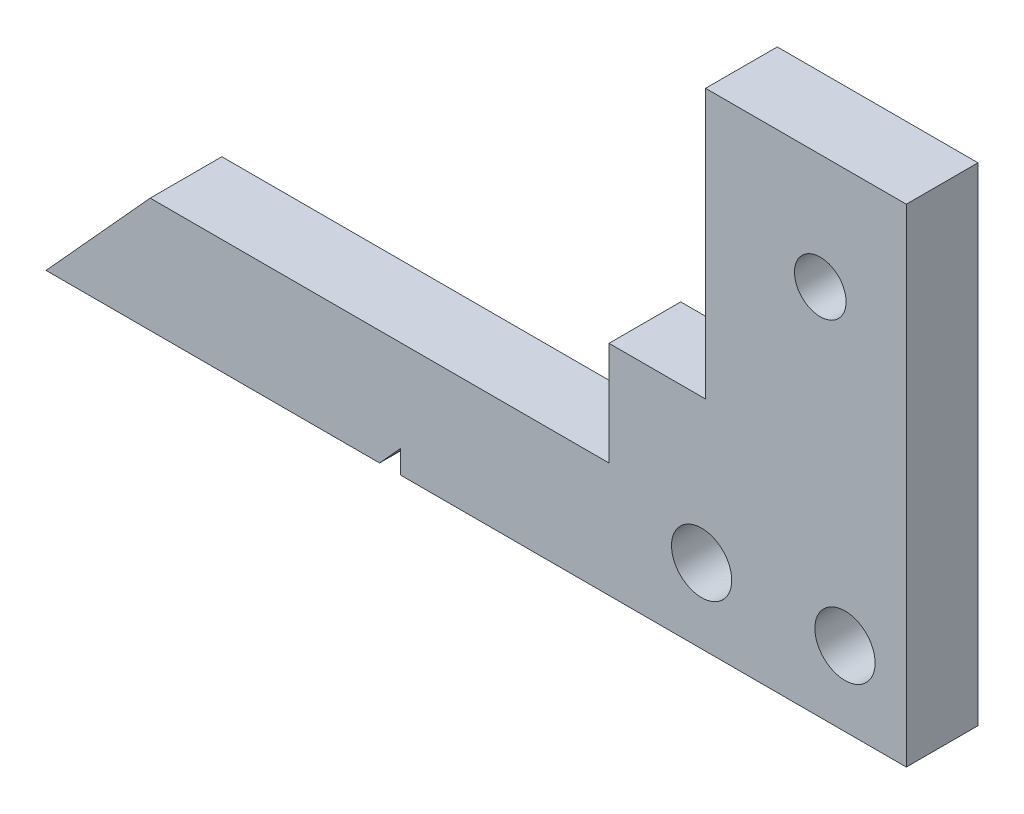
ISO-10303-21;
HEADER;
FILE_DESCRIPTION(('STEP AP214'),'2;1');
FILE_NAME('part.step','',(''),(''),'','','');
FILE_SCHEMA(('AUTOMOTIVE_DESIGN { 1 0 10303 214 1 1 1 1 }'));
ENDSEC;
DATA;
#1=APPLICATION_CONTEXT('core data for automotive mechanical design processes');
#2=APPLICATION_PROTOCOL_DEFINITION('international standard','automotive_design',2000,#1);
#3=PRODUCT_CONTEXT('',#1,'mechanical');
#4=PRODUCT('Part','Part','',(#3));
#5=PRODUCT_RELATED_PRODUCT_CATEGORY('part','',(#4));
#6=PRODUCT_DEFINITION_FORMATION('','',#4);
#7=PRODUCT_DEFINITION_CONTEXT('part definition',#1,'design');
#8=PRODUCT_DEFINITION('design','',#6,#7);
#9=PRODUCT_DEFINITION_SHAPE('','',#8);
#10=(LENGTH_UNIT() NAMED_UNIT(*) SI_UNIT(.MILLI.,.METRE.));
#11=(NAMED_UNIT(*) PLANE_ANGLE_UNIT() SI_UNIT($,.RADIAN.));
#12=(NAMED_UNIT(*) SI_UNIT($,.STERADIAN.) SOLID_ANGLE_UNIT());
#13=UNCERTAINTY_MEASURE_WITH_UNIT(LENGTH_MEASURE(1.E-05),#10,'distance_accuracy_value','');
#14=(GEOMETRIC_REPRESENTATION_CONTEXT(3) GLOBAL_UNCERTAINTY_ASSIGNED_CONTEXT((#13)) GLOBAL_UNIT_ASSIGNED_CONTEXT((#10,
#11,#12)) REPRESENTATION_CONTEXT('',''));
#15=CARTESIAN_POINT('',(0.,0.,0.));
#16=DIRECTION('',(0.,0.,1.));
#17=DIRECTION('',(1.,0.,0.));
#18=AXIS2_PLACEMENT_3D('',#15,#16,#17);
#19=CARTESIAN_POINT('',(0.,0.,3.175));
#20=DIRECTION('',(0.,0.,-1.));
#21=DIRECTION('',(-1.,0.,0.));
#22=AXIS2_PLACEMENT_3D('',#19,#20,#21);
#23=PLANE('',#22);
#24=DIRECTION('',(1.,0.,0.));
#25=VECTOR('',#24,1.);
#26=CARTESIAN_POINT('',(0.,0.,3.175));
#27=LINE('',#26,#25);
#28=CARTESIAN_POINT('',(0.,0.,3.175));
#29=VERTEX_POINT('',#28);
#30=CARTESIAN_POINT('',(14.773655525725,0.,3.175));
#31=VERTEX_POINT('',#30);
#32=EDGE_CURVE('E175',#29,#31,#27,.T.);
#33=ORIENTED_EDGE('',*,*,#32,.T.);
#34=DIRECTION('',(0.672311585903437,0.740268283435138,0.));
#35=VECTOR('',#34,1.);
#36=CARTESIAN_POINT('',(14.773655525725,0.,3.175));
#37=LINE('',#36,#35);
#38=CARTESIAN_POINT('',(15.7005576806385,1.02059265601992,3.175));
#39=VERTEX_POINT('',#38);
#40=EDGE_CURVE('E108',#31,#39,#37,.T.);
#41=ORIENTED_EDGE('',*,*,#40,.T.);
#42=DIRECTION('',(0.,-1.,0.));
#43=VECTOR('',#42,1.);
#44=CARTESIAN_POINT('',(15.7005576806385,1.02059265601992,3.175));
#45=LINE('',#44,#43);
#46=CARTESIAN_POINT('',(15.7005576806385,0.,3.175));
#47=VERTEX_POINT('',#46);
#48=EDGE_CURVE('E199',#39,#47,#45,.T.);
#49=ORIENTED_EDGE('',*,*,#48,.T.);
#50=DIRECTION('',(1.,0.,0.));
#51=VECTOR('',#50,1.);
#52=CARTESIAN_POINT('',(15.7005576806385,0.,3.175));
#53=LINE('',#52,#51);
#54=CARTESIAN_POINT('',(38.1,0.,3.175));
#55=VERTEX_POINT('',#54);
#56=EDGE_CURVE('E218',#47,#55,#53,.T.);
#57=ORIENTED_EDGE('',*,*,#56,.T.);
#58=DIRECTION('',(0.,1.,0.));
#59=VECTOR('',#58,1.);
#60=CARTESIAN_POINT('',(38.1,21.59,3.175));
#61=LINE('',#60,#59);
#62=CARTESIAN_POINT('',(38.1,21.59,3.175));
#63=VERTEX_POINT('',#62);
#64=EDGE_CURVE('E215',#55,#63,#61,.T.);
#65=ORIENTED_EDGE('',*,*,#64,.T.);
#66=DIRECTION('',(-1.,0.,0.));
#67=VECTOR('',#66,1.);
#68=CARTESIAN_POINT('',(29.21,21.59,3.175));
#69=LINE('',#68,#67);
#70=CARTESIAN_POINT('',(29.21,21.59,3.175));
#71=VERTEX_POINT('',#70);
#72=EDGE_CURVE('E217',#63,#71,#69,.T.);
#73=ORIENTED_EDGE('',*,*,#72,.T.);
#74=DIRECTION('',(0.,-1.,0.));
#75=VECTOR('',#74,1.);
#76=CARTESIAN_POINT('',(29.21,9.67178294887858,3.175));
#77=LINE('',#76,#75);
#78=CARTESIAN_POINT('',(29.21,9.67178294887858,3.175));
#79=VERTEX_POINT('',#78);
#80=EDGE_CURVE('E220',#71,#79,#77,.T.);
#81=ORIENTED_EDGE('',*,*,#80,.T.);
#82=DIRECTION('',(-1.,0.,0.));
#83=VECTOR('',#82,1.);
#84=CARTESIAN_POINT('',(24.933655525725,9.67178294887858,3.175));
#85=LINE('',#84,#83);
#86=CARTESIAN_POINT('',(24.933655525725,9.67178294887858,3.175));
#87=VERTEX_POINT('',#86);
#88=EDGE_CURVE('E136',#79,#87,#85,.T.);
#89=ORIENTED_EDGE('',*,*,#88,.T.);
#90=DIRECTION('',(0.,-1.,0.));
#91=VECTOR('',#90,1.);
#92=CARTESIAN_POINT('',(24.933655525725,5.08,3.175));
#93=LINE('',#92,#91);
#94=CARTESIAN_POINT('',(24.933655525725,5.08,3.175));
#95=VERTEX_POINT('',#94);
#96=EDGE_CURVE('E130',#87,#95,#93,.T.);
#97=ORIENTED_EDGE('',*,*,#96,.T.);
#98=DIRECTION('',(-1.,0.,0.));
#99=VECTOR('',#98,1.);
#100=CARTESIAN_POINT('',(4.61365552572496,5.08,3.175));
#101=LINE('',#100,#99);
#102=CARTESIAN_POINT('',(4.61365552572496,5.08,3.175));
#103=VERTEX_POINT('',#102);
#104=EDGE_CURVE('E134',#95,#103,#101,.T.);
#105=ORIENTED_EDGE('',*,*,#104,.T.);
#106=DIRECTION('',(-0.672311585903436,-0.740268283435139,0.));
#107=VECTOR('',#106,1.);
#108=CARTESIAN_POINT('',(0.,0.,3.175));
#109=LINE('',#108,#107);
#110=EDGE_CURVE('E56',#103,#29,#109,.T.);
#111=ORIENTED_EDGE('',*,*,#110,.T.);
#112=EDGE_LOOP('',(#33,#41,#49,#57,#65,#73,#81,#89,#97,#105,#111));
#113=FACE_BOUND('',#112,.T.);
#114=CARTESIAN_POINT('',(29.0339931584545,3.29950985593106,3.175));
#115=DIRECTION('',(0.,0.,1.));
#116=DIRECTION('',(1.,0.,0.));
#117=AXIS2_PLACEMENT_3D('',#114,#115,#116);
#118=CIRCLE('',#117,1.3335);
#119=CARTESIAN_POINT('',(30.3674931584545,3.29950985593106,3.175));
#120=VERTEX_POINT('',#119);
#121=EDGE_CURVE('E158',#120,#120,#118,.T.);
#122=ORIENTED_EDGE('',*,*,#121,.F.);
#123=EDGE_LOOP('',(#122));
#124=FACE_BOUND('',#123,.T.);
#125=CARTESIAN_POINT('',(35.3839931584545,3.29950985593106,3.175));
#126=DIRECTION('',(0.,0.,1.));
#127=DIRECTION('',(1.,0.,0.));
#128=AXIS2_PLACEMENT_3D('',#125,#126,#127);
#129=CIRCLE('',#128,1.3335);
#130=CARTESIAN_POINT('',(36.7174931584545,3.29950985593106,3.175));
#131=VERTEX_POINT('',#130);
#132=EDGE_CURVE('E277',#131,#131,#129,.T.);
#133=ORIENTED_EDGE('',*,*,#132,.F.);
#134=EDGE_LOOP('',(#133));
#135=FACE_BOUND('',#134,.T.);
#136=CARTESIAN_POINT('',(34.29,16.51,3.175));
#137=DIRECTION('',(0.,0.,1.));
#138=DIRECTION('',(1.,0.,0.));
#139=AXIS2_PLACEMENT_3D('',#136,#137,#138);
#140=CIRCLE('',#139,1.143);
#141=CARTESIAN_POINT('',(35.433,16.51,3.175));
#142=VERTEX_POINT('',#141);
#143=EDGE_CURVE('E268',#142,#142,#140,.T.);
#144=ORIENTED_EDGE('',*,*,#143,.F.);
#145=EDGE_LOOP('',(#144));
#146=FACE_BOUND('',#145,.T.);
#147=ADVANCED_FACE('F39',(#113,#124,#135,#146),#23,.F.);
#148=CARTESIAN_POINT('',(0.,0.,0.));
#149=DIRECTION('',(0.,0.,-1.));
#150=DIRECTION('',(-1.,0.,0.));
#151=AXIS2_PLACEMENT_3D('',#148,#149,#150);
#152=PLANE('',#151);
#153=CARTESIAN_POINT('',(35.3839931584545,3.29950985593106,0.));
#154=DIRECTION('',(0.,0.,1.));
#155=DIRECTION('',(1.,0.,0.));
#156=AXIS2_PLACEMENT_3D('',#153,#154,#155);
#157=CIRCLE('',#156,1.3335);
#158=CARTESIAN_POINT('',(36.7174931584545,3.29950985593106,0.));
#159=VERTEX_POINT('',#158);
#160=EDGE_CURVE('E274',#159,#159,#157,.T.);
#161=ORIENTED_EDGE('',*,*,#160,.T.);
#162=EDGE_LOOP('',(#161));
#163=FACE_BOUND('',#162,.T.);
#164=DIRECTION('',(1.,0.,0.));
#165=VECTOR('',#164,1.);
#166=CARTESIAN_POINT('',(0.,0.,0.));
#167=LINE('',#166,#165);
#168=CARTESIAN_POINT('',(0.,0.,0.));
#169=VERTEX_POINT('',#168);
#170=CARTESIAN_POINT('',(14.773655525725,0.,0.));
#171=VERTEX_POINT('',#170);
#172=EDGE_CURVE('E154',#169,#171,#167,.T.);
#173=ORIENTED_EDGE('',*,*,#172,.F.);
#174=DIRECTION('',(-0.672311585903436,-0.740268283435139,0.));
#175=VECTOR('',#174,1.);
#176=CARTESIAN_POINT('',(0.,0.,0.));
#177=LINE('',#176,#175);
#178=CARTESIAN_POINT('',(4.61365552572496,5.08,0.));
#179=VERTEX_POINT('',#178);
#180=EDGE_CURVE('E100',#179,#169,#177,.T.);
#181=ORIENTED_EDGE('',*,*,#180,.F.);
#182=DIRECTION('',(-1.,0.,0.));
#183=VECTOR('',#182,1.);
#184=CARTESIAN_POINT('',(4.61365552572496,5.08,0.));
#185=LINE('',#184,#183);
#186=CARTESIAN_POINT('',(24.933655525725,5.08,0.));
#187=VERTEX_POINT('',#186);
#188=EDGE_CURVE('E94',#187,#179,#185,.T.);
#189=ORIENTED_EDGE('',*,*,#188,.F.);
#190=DIRECTION('',(0.,-1.,0.));
#191=VECTOR('',#190,1.);
#192=CARTESIAN_POINT('',(24.933655525725,5.08,0.));
#193=LINE('',#192,#191);
#194=CARTESIAN_POINT('',(24.933655525725,9.67178294887858,0.));
#195=VERTEX_POINT('',#194);
#196=EDGE_CURVE('E144',#195,#187,#193,.T.);
#197=ORIENTED_EDGE('',*,*,#196,.F.);
#198=DIRECTION('',(-1.,0.,0.));
#199=VECTOR('',#198,1.);
#200=CARTESIAN_POINT('',(24.933655525725,9.67178294887858,0.));
#201=LINE('',#200,#199);
#202=CARTESIAN_POINT('',(29.21,9.67178294887858,0.));
#203=VERTEX_POINT('',#202);
#204=EDGE_CURVE('E170',#203,#195,#201,.T.);
#205=ORIENTED_EDGE('',*,*,#204,.F.);
#206=DIRECTION('',(0.,-1.,0.));
#207=VECTOR('',#206,1.);
#208=CARTESIAN_POINT('',(29.21,9.67178294887858,0.));
#209=LINE('',#208,#207);
#210=CARTESIAN_POINT('',(29.21,21.59,0.));
#211=VERTEX_POINT('',#210);
#212=EDGE_CURVE('E168',#211,#203,#209,.T.);
#213=ORIENTED_EDGE('',*,*,#212,.F.);
#214=DIRECTION('',(-1.,0.,0.));
#215=VECTOR('',#214,1.);
#216=CARTESIAN_POINT('',(29.21,21.59,0.));
#217=LINE('',#216,#215);
#218=CARTESIAN_POINT('',(38.1,21.59,0.));
#219=VERTEX_POINT('',#218);
#220=EDGE_CURVE('E166',#219,#211,#217,.T.);
#221=ORIENTED_EDGE('',*,*,#220,.F.);
#222=DIRECTION('',(0.,1.,0.));
#223=VECTOR('',#222,1.);
#224=CARTESIAN_POINT('',(38.1,21.59,0.));
#225=LINE('',#224,#223);
#226=CARTESIAN_POINT('',(38.1,0.,0.));
#227=VERTEX_POINT('',#226);
#228=EDGE_CURVE('E164',#227,#219,#225,.T.);
#229=ORIENTED_EDGE('',*,*,#228,.F.);
#230=DIRECTION('',(1.,0.,0.));
#231=VECTOR('',#230,1.);
#232=CARTESIAN_POINT('',(15.7005576806385,0.,0.));
#233=LINE('',#232,#231);
#234=CARTESIAN_POINT('',(15.7005576806385,0.,0.));
#235=VERTEX_POINT('',#234);
#236=EDGE_CURVE('E162',#235,#227,#233,.T.);
#237=ORIENTED_EDGE('',*,*,#236,.F.);
#238=DIRECTION('',(0.,-1.,0.));
#239=VECTOR('',#238,1.);
#240=CARTESIAN_POINT('',(15.7005576806385,1.02059265601992,0.));
#241=LINE('',#240,#239);
#242=CARTESIAN_POINT('',(15.7005576806385,1.02059265601992,0.));
#243=VERTEX_POINT('',#242);
#244=EDGE_CURVE('E160',#243,#235,#241,.T.);
#245=ORIENTED_EDGE('',*,*,#244,.F.);
#246=DIRECTION('',(0.672311585903437,0.740268283435138,0.));
#247=VECTOR('',#246,1.);
#248=CARTESIAN_POINT('',(14.773655525725,0.,0.));
#249=LINE('',#248,#247);
#250=EDGE_CURVE('E157',#171,#243,#249,.T.);
#251=ORIENTED_EDGE('',*,*,#250,.F.);
#252=EDGE_LOOP('',(#173,#181,#189,#197,#205,#213,#221,#229,#237,#245,#251));
#253=FACE_BOUND('',#252,.T.);
#254=CARTESIAN_POINT('',(29.0339931584545,3.29950985593106,0.));
#255=DIRECTION('',(0.,0.,1.));
#256=DIRECTION('',(1.,0.,0.));
#257=AXIS2_PLACEMENT_3D('',#254,#255,#256);
#258=CIRCLE('',#257,1.3335);
#259=CARTESIAN_POINT('',(30.3674931584545,3.29950985593106,0.));
#260=VERTEX_POINT('',#259);
#261=EDGE_CURVE('E280',#260,#260,#258,.T.);
#262=ORIENTED_EDGE('',*,*,#261,.T.);
#263=EDGE_LOOP('',(#262));
#264=FACE_BOUND('',#263,.T.);
#265=CARTESIAN_POINT('',(34.29,16.51,0.));
#266=DIRECTION('',(0.,0.,1.));
#267=DIRECTION('',(1.,0.,0.));
#268=AXIS2_PLACEMENT_3D('',#265,#266,#267);
#269=CIRCLE('',#268,1.143);
#270=CARTESIAN_POINT('',(35.433,16.51,0.));
#271=VERTEX_POINT('',#270);
#272=EDGE_CURVE('E271',#271,#271,#269,.T.);
#273=ORIENTED_EDGE('',*,*,#272,.T.);
#274=EDGE_LOOP('',(#273));
#275=FACE_BOUND('',#274,.T.);
#276=ADVANCED_FACE('F203',(#163,#253,#264,#275),#152,.T.);
#277=CARTESIAN_POINT('',(0.,0.,3.175));
#278=DIRECTION('',(0.,1.,0.));
#279=DIRECTION('',(0.,0.,1.));
#280=AXIS2_PLACEMENT_3D('',#277,#278,#279);
#281=PLANE('',#280);
#282=ORIENTED_EDGE('',*,*,#172,.T.);
#283=DIRECTION('',(0.,0.,-1.));
#284=VECTOR('',#283,1.);
#285=CARTESIAN_POINT('',(14.773655525725,0.,3.175));
#286=LINE('',#285,#284);
#287=EDGE_CURVE('E11',#31,#171,#286,.T.);
#288=ORIENTED_EDGE('',*,*,#287,.F.);
#289=ORIENTED_EDGE('',*,*,#32,.F.);
#290=DIRECTION('',(0.,0.,-1.));
#291=VECTOR('',#290,1.);
#292=CARTESIAN_POINT('',(0.,0.,3.175));
#293=LINE('',#292,#291);
#294=EDGE_CURVE('E150',#29,#169,#293,.T.);
#295=ORIENTED_EDGE('',*,*,#294,.T.);
#296=EDGE_LOOP('',(#282,#288,#289,#295));
#297=FACE_BOUND('',#296,.T.);
#298=ADVANCED_FACE('F41',(#297),#281,.F.);
#299=CARTESIAN_POINT('',(14.773655525725,0.,3.175));
#300=DIRECTION('',(-0.740268283435138,0.672311585903437,0.));
#301=DIRECTION('',(-0.672311585903437,-0.740268283435138,0.));
#302=AXIS2_PLACEMENT_3D('',#299,#300,#301);
#303=PLANE('',#302);
#304=ORIENTED_EDGE('',*,*,#250,.T.);
#305=DIRECTION('',(0.,0.,-1.));
#306=VECTOR('',#305,1.);
#307=CARTESIAN_POINT('',(15.7005576806385,1.02059265601992,3.175));
#308=LINE('',#307,#306);
#309=EDGE_CURVE('E48',#39,#243,#308,.T.);
#310=ORIENTED_EDGE('',*,*,#309,.F.);
#311=ORIENTED_EDGE('',*,*,#40,.F.);
#312=ORIENTED_EDGE('',*,*,#287,.T.);
#313=EDGE_LOOP('',(#304,#310,#311,#312));
#314=FACE_BOUND('',#313,.T.);
#315=ADVANCED_FACE('F376',(#314),#303,.F.);
#316=CARTESIAN_POINT('',(15.7005576806385,1.02059265601992,3.175));
#317=DIRECTION('',(1.,0.,0.));
#318=DIRECTION('',(0.,0.,-1.));
#319=AXIS2_PLACEMENT_3D('',#316,#317,#318);
#320=PLANE('',#319);
#321=ORIENTED_EDGE('',*,*,#244,.T.);
#322=DIRECTION('',(0.,0.,-1.));
#323=VECTOR('',#322,1.);
#324=CARTESIAN_POINT('',(15.7005576806385,0.,3.175));
#325=LINE('',#324,#323);
#326=EDGE_CURVE('E191',#47,#235,#325,.T.);
#327=ORIENTED_EDGE('',*,*,#326,.F.);
#328=ORIENTED_EDGE('',*,*,#48,.F.);
#329=ORIENTED_EDGE('',*,*,#309,.T.);
#330=EDGE_LOOP('',(#321,#327,#328,#329));
#331=FACE_BOUND('',#330,.T.);
#332=ADVANCED_FACE('F197',(#331),#320,.F.);
#333=CARTESIAN_POINT('',(15.7005576806385,0.,3.175));
#334=DIRECTION('',(0.,1.,0.));
#335=DIRECTION('',(0.,0.,1.));
#336=AXIS2_PLACEMENT_3D('',#333,#334,#335);
#337=PLANE('',#336);
#338=ORIENTED_EDGE('',*,*,#236,.T.);
#339=DIRECTION('',(0.,0.,-1.));
#340=VECTOR('',#339,1.);
#341=CARTESIAN_POINT('',(38.1,0.,3.175));
#342=LINE('',#341,#340);
#343=EDGE_CURVE('E188',#55,#227,#342,.T.);
#344=ORIENTED_EDGE('',*,*,#343,.F.);
#345=ORIENTED_EDGE('',*,*,#56,.F.);
#346=ORIENTED_EDGE('',*,*,#326,.T.);
#347=EDGE_LOOP('',(#338,#344,#345,#346));
#348=FACE_BOUND('',#347,.T.);
#349=ADVANCED_FACE('F209',(#348),#337,.F.);
#350=CARTESIAN_POINT('',(38.1,21.59,3.175));
#351=DIRECTION('',(-1.,0.,0.));
#352=DIRECTION('',(0.,-1.,0.));
#353=AXIS2_PLACEMENT_3D('',#350,#351,#352);
#354=PLANE('',#353);
#355=ORIENTED_EDGE('',*,*,#228,.T.);
#356=DIRECTION('',(0.,0.,-1.));
#357=VECTOR('',#356,1.);
#358=CARTESIAN_POINT('',(38.1,21.59,3.175));
#359=LINE('',#358,#357);
#360=EDGE_CURVE('E185',#63,#219,#359,.T.);
#361=ORIENTED_EDGE('',*,*,#360,.F.);
#362=ORIENTED_EDGE('',*,*,#64,.F.);
#363=ORIENTED_EDGE('',*,*,#343,.T.);
#364=EDGE_LOOP('',(#355,#361,#362,#363));
#365=FACE_BOUND('',#364,.T.);
#366=ADVANCED_FACE('F213',(#365),#354,.F.);
#367=CARTESIAN_POINT('',(29.21,21.59,3.175));
#368=DIRECTION('',(0.,-1.,0.));
#369=DIRECTION('',(0.,0.,-1.));
#370=AXIS2_PLACEMENT_3D('',#367,#368,#369);
#371=PLANE('',#370);
#372=ORIENTED_EDGE('',*,*,#220,.T.);
#373=DIRECTION('',(0.,0.,-1.));
#374=VECTOR('',#373,1.);
#375=CARTESIAN_POINT('',(29.21,21.59,3.175));
#376=LINE('',#375,#374);
#377=EDGE_CURVE('E182',#71,#211,#376,.T.);
#378=ORIENTED_EDGE('',*,*,#377,.F.);
#379=ORIENTED_EDGE('',*,*,#72,.F.);
#380=ORIENTED_EDGE('',*,*,#360,.T.);
#381=EDGE_LOOP('',(#372,#378,#379,#380));
#382=FACE_BOUND('',#381,.T.);
#383=ADVANCED_FACE('F342',(#382),#371,.F.);
#384=CARTESIAN_POINT('',(29.21,9.67178294887858,3.175));
#385=DIRECTION('',(1.,0.,0.));
#386=DIRECTION('',(0.,0.,-1.));
#387=AXIS2_PLACEMENT_3D('',#384,#385,#386);
#388=PLANE('',#387);
#389=ORIENTED_EDGE('',*,*,#212,.T.);
#390=DIRECTION('',(0.,0.,-1.));
#391=VECTOR('',#390,1.);
#392=CARTESIAN_POINT('',(29.21,9.67178294887858,3.175));
#393=LINE('',#392,#391);
#394=EDGE_CURVE('E179',#79,#203,#393,.T.);
#395=ORIENTED_EDGE('',*,*,#394,.F.);
#396=ORIENTED_EDGE('',*,*,#80,.F.);
#397=ORIENTED_EDGE('',*,*,#377,.T.);
#398=EDGE_LOOP('',(#389,#395,#396,#397));
#399=FACE_BOUND('',#398,.T.);
#400=ADVANCED_FACE('F229',(#399),#388,.F.);
#401=CARTESIAN_POINT('',(24.933655525725,9.67178294887858,3.175));
#402=DIRECTION('',(0.,-1.,0.));
#403=DIRECTION('',(0.,0.,-1.));
#404=AXIS2_PLACEMENT_3D('',#401,#402,#403);
#405=PLANE('',#404);
#406=ORIENTED_EDGE('',*,*,#204,.T.);
#407=DIRECTION('',(0.,0.,-1.));
#408=VECTOR('',#407,1.);
#409=CARTESIAN_POINT('',(24.933655525725,9.67178294887858,3.175));
#410=LINE('',#409,#408);
#411=EDGE_CURVE('E145',#87,#195,#410,.T.);
#412=ORIENTED_EDGE('',*,*,#411,.F.);
#413=ORIENTED_EDGE('',*,*,#88,.F.);
#414=ORIENTED_EDGE('',*,*,#394,.T.);
#415=EDGE_LOOP('',(#406,#412,#413,#414));
#416=FACE_BOUND('',#415,.T.);
#417=ADVANCED_FACE('F233',(#416),#405,.F.);
#418=CARTESIAN_POINT('',(24.933655525725,5.08,3.175));
#419=DIRECTION('',(1.,0.,0.));
#420=DIRECTION('',(0.,0.,-1.));
#421=AXIS2_PLACEMENT_3D('',#418,#419,#420);
#422=PLANE('',#421);
#423=ORIENTED_EDGE('',*,*,#196,.T.);
#424=DIRECTION('',(0.,0.,-1.));
#425=VECTOR('',#424,1.);
#426=CARTESIAN_POINT('',(24.933655525725,5.08,3.175));
#427=LINE('',#426,#425);
#428=EDGE_CURVE('E141',#95,#187,#427,.T.);
#429=ORIENTED_EDGE('',*,*,#428,.F.);
#430=ORIENTED_EDGE('',*,*,#96,.F.);
#431=ORIENTED_EDGE('',*,*,#411,.T.);
#432=EDGE_LOOP('',(#423,#429,#430,#431));
#433=FACE_BOUND('',#432,.T.);
#434=ADVANCED_FACE('F142',(#433),#422,.F.);
#435=CARTESIAN_POINT('',(4.61365552572496,5.08,3.175));
#436=DIRECTION('',(0.,-1.,0.));
#437=DIRECTION('',(0.,0.,-1.));
#438=AXIS2_PLACEMENT_3D('',#435,#436,#437);
#439=PLANE('',#438);
#440=ORIENTED_EDGE('',*,*,#188,.T.);
#441=DIRECTION('',(0.,0.,-1.));
#442=VECTOR('',#441,1.);
#443=CARTESIAN_POINT('',(4.61365552572496,5.08,3.175));
#444=LINE('',#443,#442);
#445=EDGE_CURVE('E146',#103,#179,#444,.T.);
#446=ORIENTED_EDGE('',*,*,#445,.F.);
#447=ORIENTED_EDGE('',*,*,#104,.F.);
#448=ORIENTED_EDGE('',*,*,#428,.T.);
#449=EDGE_LOOP('',(#440,#446,#447,#448));
#450=FACE_BOUND('',#449,.T.);
#451=ADVANCED_FACE('F148',(#450),#439,.F.);
#452=CARTESIAN_POINT('',(0.,0.,3.175));
#453=DIRECTION('',(0.740268283435139,-0.672311585903436,0.));
#454=DIRECTION('',(0.672311585903436,0.740268283435139,0.));
#455=AXIS2_PLACEMENT_3D('',#452,#453,#454);
#456=PLANE('',#455);
#457=ORIENTED_EDGE('',*,*,#180,.T.);
#458=ORIENTED_EDGE('',*,*,#294,.F.);
#459=ORIENTED_EDGE('',*,*,#110,.F.);
#460=ORIENTED_EDGE('',*,*,#445,.T.);
#461=EDGE_LOOP('',(#457,#458,#459,#460));
#462=FACE_BOUND('',#461,.T.);
#463=ADVANCED_FACE('F237',(#462),#456,.F.);
#464=CARTESIAN_POINT('',(29.0339931584545,3.29950985593106,3.175));
#465=DIRECTION('',(0.,0.,-1.));
#466=DIRECTION('',(-1.,0.,0.));
#467=AXIS2_PLACEMENT_3D('',#464,#465,#466);
#468=CYLINDRICAL_SURFACE('',#467,1.3335);
#469=ORIENTED_EDGE('',*,*,#121,.T.);
#470=EDGE_LOOP('',(#469));
#471=FACE_BOUND('',#470,.T.);
#472=ORIENTED_EDGE('',*,*,#261,.F.);
#473=EDGE_LOOP('',(#472));
#474=FACE_BOUND('',#473,.T.);
#475=ADVANCED_FACE('F239',(#471,#474),#468,.F.);
#476=CARTESIAN_POINT('',(35.3839931584545,3.29950985593106,3.175));
#477=DIRECTION('',(0.,0.,-1.));
#478=DIRECTION('',(-1.,0.,0.));
#479=AXIS2_PLACEMENT_3D('',#476,#477,#478);
#480=CYLINDRICAL_SURFACE('',#479,1.3335);
#481=ORIENTED_EDGE('',*,*,#132,.T.);
#482=EDGE_LOOP('',(#481));
#483=FACE_BOUND('',#482,.T.);
#484=ORIENTED_EDGE('',*,*,#160,.F.);
#485=EDGE_LOOP('',(#484));
#486=FACE_BOUND('',#485,.T.);
#487=ADVANCED_FACE('F245',(#483,#486),#480,.F.);
#488=CARTESIAN_POINT('',(34.29,16.51,3.175));
#489=DIRECTION('',(0.,0.,-1.));
#490=DIRECTION('',(-1.,0.,0.));
#491=AXIS2_PLACEMENT_3D('',#488,#489,#490);
#492=CYLINDRICAL_SURFACE('',#491,1.143);
#493=ORIENTED_EDGE('',*,*,#143,.T.);
#494=EDGE_LOOP('',(#493));
#495=FACE_BOUND('',#494,.T.);
#496=ORIENTED_EDGE('',*,*,#272,.F.);
#497=EDGE_LOOP('',(#496));
#498=FACE_BOUND('',#497,.T.);
#499=ADVANCED_FACE('F259',(#495,#498),#492,.F.);
#500=CLOSED_SHELL('',(#147,#276,#298,#315,#332,#349,#366,#383,#400,#417,#434,#451,#463,#475,
#487,#499));
#501=MANIFOLD_SOLID_BREP('B2',#500);
#502=ADVANCED_BREP_SHAPE_REPRESENTATION('',(#18,#501),#14);
#503=SHAPE_DEFINITION_REPRESENTATION(#9,#502);
ENDSEC;
END-ISO-10303-21;
